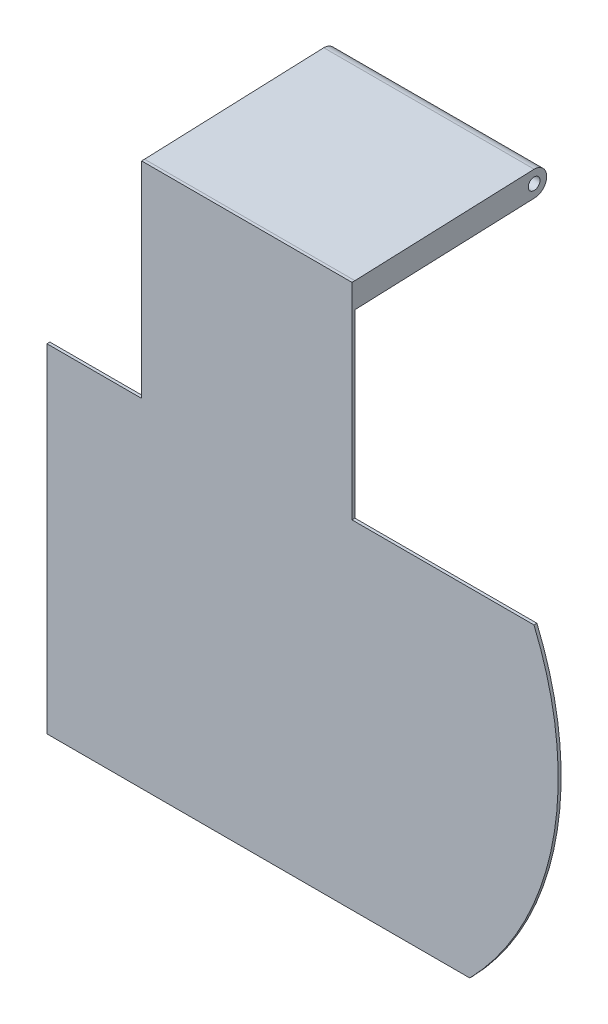
ISO-10303-21;
HEADER;
FILE_DESCRIPTION(('STEP AP214'),'2;1');
FILE_NAME('part.step','',(''),(''),'','','');
FILE_SCHEMA(('AUTOMOTIVE_DESIGN { 1 0 10303 214 1 1 1 1 }'));
ENDSEC;
DATA;
#1=APPLICATION_CONTEXT('core data for automotive mechanical design processes');
#2=APPLICATION_PROTOCOL_DEFINITION('international standard','automotive_design',2000,#1);
#3=PRODUCT_CONTEXT('',#1,'mechanical');
#4=PRODUCT('Part','Part','',(#3));
#5=PRODUCT_RELATED_PRODUCT_CATEGORY('part','',(#4));
#6=PRODUCT_DEFINITION_FORMATION('','',#4);
#7=PRODUCT_DEFINITION_CONTEXT('part definition',#1,'design');
#8=PRODUCT_DEFINITION('design','',#6,#7);
#9=PRODUCT_DEFINITION_SHAPE('','',#8);
#10=(LENGTH_UNIT() NAMED_UNIT(*) SI_UNIT(.MILLI.,.METRE.));
#11=(NAMED_UNIT(*) PLANE_ANGLE_UNIT() SI_UNIT($,.RADIAN.));
#12=(NAMED_UNIT(*) SI_UNIT($,.STERADIAN.) SOLID_ANGLE_UNIT());
#13=UNCERTAINTY_MEASURE_WITH_UNIT(LENGTH_MEASURE(1.E-05),#10,'distance_accuracy_value','');
#14=(GEOMETRIC_REPRESENTATION_CONTEXT(3) GLOBAL_UNCERTAINTY_ASSIGNED_CONTEXT((#13)) GLOBAL_UNIT_ASSIGNED_CONTEXT((#10,
#11,#12)) REPRESENTATION_CONTEXT('',''));
#15=CARTESIAN_POINT('',(0.,0.,0.));
#16=DIRECTION('',(0.,0.,1.));
#17=DIRECTION('',(1.,0.,0.));
#18=AXIS2_PLACEMENT_3D('',#15,#16,#17);
#19=CARTESIAN_POINT('',(0.,0.,0.));
#20=DIRECTION('',(0.,0.,1.));
#21=DIRECTION('',(1.,0.,0.));
#22=AXIS2_PLACEMENT_3D('',#19,#20,#21);
#23=PLANE('',#22);
#24=DIRECTION('',(-1.,0.,0.));
#25=VECTOR('',#24,1.);
#26=CARTESIAN_POINT('',(102.003771717629,102.421724260112,0.));
#27=LINE('',#26,#25);
#28=CARTESIAN_POINT('',(35.8048401531913,102.421724260112,0.));
#29=VERTEX_POINT('',#28);
#30=CARTESIAN_POINT('',(-35.7951598468087,102.421724260112,0.));
#31=VERTEX_POINT('',#30);
#32=EDGE_CURVE('E55',#29,#31,#27,.T.);
#33=ORIENTED_EDGE('',*,*,#32,.F.);
#34=DIRECTION('',(0.,1.,0.));
#35=VECTOR('',#34,1.);
#36=CARTESIAN_POINT('',(35.8048401531913,41.,0.));
#37=LINE('',#36,#35);
#38=CARTESIAN_POINT('',(35.8048401531913,41.,0.));
#39=VERTEX_POINT('',#38);
#40=EDGE_CURVE('E181',#39,#29,#37,.T.);
#41=ORIENTED_EDGE('',*,*,#40,.F.);
#42=DIRECTION('',(1.,0.,0.));
#43=VECTOR('',#42,1.);
#44=CARTESIAN_POINT('',(0.,41.,0.));
#45=LINE('',#44,#43);
#46=CARTESIAN_POINT('',(97.7496803063826,41.,0.));
#47=VERTEX_POINT('',#46);
#48=EDGE_CURVE('E224',#39,#47,#45,.T.);
#49=ORIENTED_EDGE('',*,*,#48,.T.);
#50=CARTESIAN_POINT('',(0.,0.,0.));
#51=DIRECTION('',(0.,0.,1.));
#52=DIRECTION('',(1.,0.,0.));
#53=AXIS2_PLACEMENT_3D('',#50,#51,#52);
#54=CIRCLE('',#53,106.);
#55=CARTESIAN_POINT('',(75.8946638440411,-74.,0.));
#56=VERTEX_POINT('',#55);
#57=EDGE_CURVE('E220',#56,#47,#54,.T.);
#58=ORIENTED_EDGE('',*,*,#57,.F.);
#59=DIRECTION('',(1.,0.,0.));
#60=VECTOR('',#59,1.);
#61=CARTESIAN_POINT('',(0.,-74.,0.));
#62=LINE('',#61,#60);
#63=CARTESIAN_POINT('',(-68.,-74.,0.));
#64=VERTEX_POINT('',#63);
#65=EDGE_CURVE('E197',#64,#56,#62,.T.);
#66=ORIENTED_EDGE('',*,*,#65,.F.);
#67=DIRECTION('',(0.,1.,0.));
#68=VECTOR('',#67,1.);
#69=CARTESIAN_POINT('',(-68.,0.,0.));
#70=LINE('',#69,#68);
#71=CARTESIAN_POINT('',(-68.,41.,0.));
#72=VERTEX_POINT('',#71);
#73=EDGE_CURVE('E203',#64,#72,#70,.T.);
#74=ORIENTED_EDGE('',*,*,#73,.T.);
#75=CARTESIAN_POINT('',(-35.7951598468087,41.,0.));
#76=VERTEX_POINT('',#75);
#77=EDGE_CURVE('E225',#72,#76,#45,.T.);
#78=ORIENTED_EDGE('',*,*,#77,.T.);
#79=DIRECTION('',(0.,-1.,0.));
#80=VECTOR('',#79,1.);
#81=CARTESIAN_POINT('',(-35.7951598468087,111.,0.));
#82=LINE('',#81,#80);
#83=EDGE_CURVE('E62',#31,#76,#82,.T.);
#84=ORIENTED_EDGE('',*,*,#83,.F.);
#85=EDGE_LOOP('',(#33,#41,#49,#58,#66,#74,#78,#84));
#86=FACE_BOUND('',#85,.T.);
#87=ADVANCED_FACE('F39',(#86),#23,.F.);
#88=CARTESIAN_POINT('',(0.,41.,1.));
#89=DIRECTION('',(0.,1.,0.));
#90=DIRECTION('',(0.,0.,1.));
#91=AXIS2_PLACEMENT_3D('',#88,#89,#90);
#92=PLANE('',#91);
#93=DIRECTION('',(1.,0.,0.));
#94=VECTOR('',#93,1.);
#95=CARTESIAN_POINT('',(0.,41.,1.));
#96=LINE('',#95,#94);
#97=CARTESIAN_POINT('',(-68.,41.,1.));
#98=VERTEX_POINT('',#97);
#99=CARTESIAN_POINT('',(-35.7951598468087,41.,1.));
#100=VERTEX_POINT('',#99);
#101=EDGE_CURVE('E208',#98,#100,#96,.T.);
#102=ORIENTED_EDGE('',*,*,#101,.T.);
#103=DIRECTION('',(0.,0.,-1.));
#104=VECTOR('',#103,1.);
#105=CARTESIAN_POINT('',(-35.7951598468087,41.,1.));
#106=LINE('',#105,#104);
#107=EDGE_CURVE('E194',#100,#76,#106,.T.);
#108=ORIENTED_EDGE('',*,*,#107,.T.);
#109=ORIENTED_EDGE('',*,*,#77,.F.);
#110=DIRECTION('',(0.,0.,-1.));
#111=VECTOR('',#110,1.);
#112=CARTESIAN_POINT('',(-68.,41.,1.));
#113=LINE('',#112,#111);
#114=EDGE_CURVE('E234',#98,#72,#113,.T.);
#115=ORIENTED_EDGE('',*,*,#114,.F.);
#116=EDGE_LOOP('',(#102,#108,#109,#115));
#117=FACE_BOUND('',#116,.T.);
#118=ADVANCED_FACE('F280',(#117),#92,.T.);
#119=CARTESIAN_POINT('',(0.,-74.,1.));
#120=DIRECTION('',(0.,1.,0.));
#121=DIRECTION('',(0.,0.,1.));
#122=AXIS2_PLACEMENT_3D('',#119,#120,#121);
#123=PLANE('',#122);
#124=ORIENTED_EDGE('',*,*,#65,.T.);
#125=DIRECTION('',(0.,0.,-1.));
#126=VECTOR('',#125,1.);
#127=CARTESIAN_POINT('',(75.8946638440411,-74.,1.));
#128=LINE('',#127,#126);
#129=CARTESIAN_POINT('',(75.8946638440411,-74.,1.));
#130=VERTEX_POINT('',#129);
#131=EDGE_CURVE('E11',#130,#56,#128,.T.);
#132=ORIENTED_EDGE('',*,*,#131,.F.);
#133=DIRECTION('',(1.,0.,0.));
#134=VECTOR('',#133,1.);
#135=CARTESIAN_POINT('',(0.,-74.,1.));
#136=LINE('',#135,#134);
#137=CARTESIAN_POINT('',(-68.,-74.,1.));
#138=VERTEX_POINT('',#137);
#139=EDGE_CURVE('E198',#138,#130,#136,.T.);
#140=ORIENTED_EDGE('',*,*,#139,.F.);
#141=DIRECTION('',(0.,0.,-1.));
#142=VECTOR('',#141,1.);
#143=CARTESIAN_POINT('',(-68.,-74.,1.));
#144=LINE('',#143,#142);
#145=EDGE_CURVE('E216',#138,#64,#144,.T.);
#146=ORIENTED_EDGE('',*,*,#145,.T.);
#147=EDGE_LOOP('',(#124,#132,#140,#146));
#148=FACE_BOUND('',#147,.T.);
#149=ADVANCED_FACE('F41',(#148),#123,.F.);
#150=CARTESIAN_POINT('',(0.,0.,1.));
#151=DIRECTION('',(0.,0.,-1.));
#152=DIRECTION('',(-1.,0.,0.));
#153=AXIS2_PLACEMENT_3D('',#150,#151,#152);
#154=CYLINDRICAL_SURFACE('',#153,106.);
#155=ORIENTED_EDGE('',*,*,#57,.T.);
#156=DIRECTION('',(0.,0.,-1.));
#157=VECTOR('',#156,1.);
#158=CARTESIAN_POINT('',(97.7496803063826,41.,1.));
#159=LINE('',#158,#157);
#160=CARTESIAN_POINT('',(97.7496803063826,41.,1.));
#161=VERTEX_POINT('',#160);
#162=EDGE_CURVE('E48',#161,#47,#159,.T.);
#163=ORIENTED_EDGE('',*,*,#162,.F.);
#164=CARTESIAN_POINT('',(0.,0.,1.));
#165=DIRECTION('',(0.,0.,1.));
#166=DIRECTION('',(1.,0.,0.));
#167=AXIS2_PLACEMENT_3D('',#164,#165,#166);
#168=CIRCLE('',#167,106.);
#169=EDGE_CURVE('E202',#130,#161,#168,.T.);
#170=ORIENTED_EDGE('',*,*,#169,.F.);
#171=ORIENTED_EDGE('',*,*,#131,.T.);
#172=EDGE_LOOP('',(#155,#163,#170,#171));
#173=FACE_BOUND('',#172,.T.);
#174=ADVANCED_FACE('F245',(#173),#154,.T.);
#175=DIRECTION('',(0.,0.,-1.));
#176=VECTOR('',#175,1.);
#177=CARTESIAN_POINT('',(35.8048401531913,41.,1.));
#178=LINE('',#177,#176);
#179=CARTESIAN_POINT('',(35.8048401531913,41.,1.));
#180=VERTEX_POINT('',#179);
#181=EDGE_CURVE('E191',#180,#39,#178,.T.);
#182=ORIENTED_EDGE('',*,*,#181,.F.);
#183=EDGE_CURVE('E207',#180,#161,#96,.T.);
#184=ORIENTED_EDGE('',*,*,#183,.T.);
#185=ORIENTED_EDGE('',*,*,#162,.T.);
#186=ORIENTED_EDGE('',*,*,#48,.F.);
#187=EDGE_LOOP('',(#182,#184,#185,#186));
#188=FACE_BOUND('',#187,.T.);
#189=ADVANCED_FACE('F242',(#188),#92,.T.);
#190=CARTESIAN_POINT('',(-68.,0.,1.));
#191=DIRECTION('',(-1.,0.,0.));
#192=DIRECTION('',(0.,-1.,0.));
#193=AXIS2_PLACEMENT_3D('',#190,#191,#192);
#194=PLANE('',#193);
#195=ORIENTED_EDGE('',*,*,#73,.F.);
#196=ORIENTED_EDGE('',*,*,#145,.F.);
#197=DIRECTION('',(0.,1.,0.));
#198=VECTOR('',#197,1.);
#199=CARTESIAN_POINT('',(-68.,0.,1.));
#200=LINE('',#199,#198);
#201=EDGE_CURVE('E212',#138,#98,#200,.T.);
#202=ORIENTED_EDGE('',*,*,#201,.T.);
#203=ORIENTED_EDGE('',*,*,#114,.T.);
#204=EDGE_LOOP('',(#195,#196,#202,#203));
#205=FACE_BOUND('',#204,.T.);
#206=ADVANCED_FACE('F277',(#205),#194,.T.);
#207=CARTESIAN_POINT('',(0.,0.,1.));
#208=DIRECTION('',(0.,0.,1.));
#209=DIRECTION('',(1.,0.,0.));
#210=AXIS2_PLACEMENT_3D('',#207,#208,#209);
#211=PLANE('',#210);
#212=ORIENTED_EDGE('',*,*,#139,.T.);
#213=ORIENTED_EDGE('',*,*,#169,.T.);
#214=ORIENTED_EDGE('',*,*,#183,.F.);
#215=DIRECTION('',(0.,1.,0.));
#216=VECTOR('',#215,1.);
#217=CARTESIAN_POINT('',(35.8048401531913,41.,1.));
#218=LINE('',#217,#216);
#219=CARTESIAN_POINT('',(35.8048401531913,111.,1.));
#220=VERTEX_POINT('',#219);
#221=EDGE_CURVE('E171',#180,#220,#218,.T.);
#222=ORIENTED_EDGE('',*,*,#221,.T.);
#223=DIRECTION('',(-1.,0.,0.));
#224=VECTOR('',#223,1.);
#225=CARTESIAN_POINT('',(35.8048401531913,111.,1.));
#226=LINE('',#225,#224);
#227=CARTESIAN_POINT('',(-35.7951598468087,111.,1.));
#228=VERTEX_POINT('',#227);
#229=EDGE_CURVE('E175',#220,#228,#226,.T.);
#230=ORIENTED_EDGE('',*,*,#229,.T.);
#231=DIRECTION('',(0.,-1.,0.));
#232=VECTOR('',#231,1.);
#233=CARTESIAN_POINT('',(-35.7951598468087,111.,1.));
#234=LINE('',#233,#232);
#235=EDGE_CURVE('E168',#228,#100,#234,.T.);
#236=ORIENTED_EDGE('',*,*,#235,.T.);
#237=ORIENTED_EDGE('',*,*,#101,.F.);
#238=ORIENTED_EDGE('',*,*,#201,.F.);
#239=EDGE_LOOP('',(#212,#213,#214,#222,#230,#236,#237,#238));
#240=FACE_BOUND('',#239,.T.);
#241=ADVANCED_FACE('F271',(#240),#211,.T.);
#242=CARTESIAN_POINT('',(-35.7951598468087,111.,1.));
#243=DIRECTION('',(1.,0.,0.));
#244=DIRECTION('',(0.,0.,-1.));
#245=AXIS2_PLACEMENT_3D('',#242,#243,#244);
#246=PLANE('',#245);
#247=DIRECTION('',(0.,0.,-1.));
#248=VECTOR('',#247,1.);
#249=CARTESIAN_POINT('',(-35.7951598468087,111.,1.));
#250=LINE('',#249,#248);
#251=CARTESIAN_POINT('',(-35.7951598468087,111.,0.));
#252=VERTEX_POINT('',#251);
#253=EDGE_CURVE('E178',#228,#252,#250,.T.);
#254=ORIENTED_EDGE('',*,*,#253,.T.);
#255=DIRECTION('',(0.,0.0386455009064933,-0.999252983613102));
#256=VECTOR('',#255,1.);
#257=CARTESIAN_POINT('',(-35.7951598468087,113.359137869944,-61.));
#258=LINE('',#257,#256);
#259=CARTESIAN_POINT('',(-35.7951598468087,113.359137869944,-61.));
#260=VERTEX_POINT('',#259);
#261=EDGE_CURVE('E137',#252,#260,#258,.T.);
#262=ORIENTED_EDGE('',*,*,#261,.T.);
#263=CARTESIAN_POINT('',(-35.7951598468087,109.07,-61.));
#264=DIRECTION('',(-1.,0.,0.));
#265=DIRECTION('',(0.,0.,-1.));
#266=AXIS2_PLACEMENT_3D('',#263,#264,#265);
#267=CIRCLE('',#266,4.28913786994391);
#268=CARTESIAN_POINT('',(-35.7951598468087,104.780862130056,-61.));
#269=VERTEX_POINT('',#268);
#270=EDGE_CURVE('E131',#260,#269,#267,.T.);
#271=ORIENTED_EDGE('',*,*,#270,.T.);
#272=DIRECTION('',(0.,-0.0386455009064933,0.999252983613102));
#273=VECTOR('',#272,1.);
#274=CARTESIAN_POINT('',(-35.7951598468087,104.780862130056,-61.));
#275=LINE('',#274,#273);
#276=EDGE_CURVE('E139',#269,#31,#275,.T.);
#277=ORIENTED_EDGE('',*,*,#276,.T.);
#278=ORIENTED_EDGE('',*,*,#83,.T.);
#279=ORIENTED_EDGE('',*,*,#107,.F.);
#280=ORIENTED_EDGE('',*,*,#235,.F.);
#281=EDGE_LOOP('',(#254,#262,#271,#277,#278,#279,#280));
#282=FACE_BOUND('',#281,.T.);
#283=CARTESIAN_POINT('',(-35.7951598468087,109.07,-61.));
#284=DIRECTION('',(-1.,0.,0.));
#285=DIRECTION('',(0.,0.,1.));
#286=AXIS2_PLACEMENT_3D('',#283,#284,#285);
#287=CIRCLE('',#286,2.);
#288=CARTESIAN_POINT('',(-35.7951598468087,109.07,-59.));
#289=VERTEX_POINT('',#288);
#290=EDGE_CURVE('E148',#289,#289,#287,.T.);
#291=ORIENTED_EDGE('',*,*,#290,.F.);
#292=EDGE_LOOP('',(#291));
#293=FACE_BOUND('',#292,.T.);
#294=ADVANCED_FACE('F144',(#282,#293),#246,.F.);
#295=CARTESIAN_POINT('',(35.8048401531913,41.,1.));
#296=DIRECTION('',(-1.,0.,0.));
#297=DIRECTION('',(0.,0.,1.));
#298=AXIS2_PLACEMENT_3D('',#295,#296,#297);
#299=PLANE('',#298);
#300=ORIENTED_EDGE('',*,*,#40,.T.);
#301=DIRECTION('',(0.,0.0386455009064933,-0.999252983613102));
#302=VECTOR('',#301,1.);
#303=CARTESIAN_POINT('',(35.8048401531913,104.780862130056,-61.));
#304=LINE('',#303,#302);
#305=CARTESIAN_POINT('',(35.8048401531913,104.780862130056,-61.));
#306=VERTEX_POINT('',#305);
#307=EDGE_CURVE('E167',#29,#306,#304,.T.);
#308=ORIENTED_EDGE('',*,*,#307,.T.);
#309=CARTESIAN_POINT('',(35.8048401531913,109.07,-61.));
#310=DIRECTION('',(-1.,0.,0.));
#311=DIRECTION('',(0.,0.,1.));
#312=AXIS2_PLACEMENT_3D('',#309,#310,#311);
#313=CIRCLE('',#312,4.28913786994391);
#314=CARTESIAN_POINT('',(35.8048401531913,113.359137869944,-61.));
#315=VERTEX_POINT('',#314);
#316=EDGE_CURVE('E133',#306,#315,#313,.F.);
#317=ORIENTED_EDGE('',*,*,#316,.T.);
#318=DIRECTION('',(0.,-0.0386455009064933,0.999252983613102));
#319=VECTOR('',#318,1.);
#320=CARTESIAN_POINT('',(35.8048401531913,113.359137869944,-61.));
#321=LINE('',#320,#319);
#322=CARTESIAN_POINT('',(35.8048401531913,111.,0.));
#323=VERTEX_POINT('',#322);
#324=EDGE_CURVE('E160',#315,#323,#321,.T.);
#325=ORIENTED_EDGE('',*,*,#324,.T.);
#326=DIRECTION('',(0.,0.,-1.));
#327=VECTOR('',#326,1.);
#328=CARTESIAN_POINT('',(35.8048401531913,111.,1.));
#329=LINE('',#328,#327);
#330=EDGE_CURVE('E188',#220,#323,#329,.T.);
#331=ORIENTED_EDGE('',*,*,#330,.F.);
#332=ORIENTED_EDGE('',*,*,#221,.F.);
#333=ORIENTED_EDGE('',*,*,#181,.T.);
#334=EDGE_LOOP('',(#300,#308,#317,#325,#331,#332,#333));
#335=FACE_BOUND('',#334,.T.);
#336=CARTESIAN_POINT('',(35.8048401531913,109.07,-61.));
#337=DIRECTION('',(-1.,0.,0.));
#338=DIRECTION('',(0.,0.,1.));
#339=AXIS2_PLACEMENT_3D('',#336,#337,#338);
#340=CIRCLE('',#339,2.);
#341=CARTESIAN_POINT('',(35.8048401531913,109.07,-59.));
#342=VERTEX_POINT('',#341);
#343=EDGE_CURVE('E163',#342,#342,#340,.F.);
#344=ORIENTED_EDGE('',*,*,#343,.F.);
#345=EDGE_LOOP('',(#344));
#346=FACE_BOUND('',#345,.T.);
#347=ADVANCED_FACE('F260',(#335,#346),#299,.F.);
#348=CARTESIAN_POINT('',(35.8048401531913,111.,1.));
#349=DIRECTION('',(0.,-1.,0.));
#350=DIRECTION('',(0.,0.,-1.));
#351=AXIS2_PLACEMENT_3D('',#348,#349,#350);
#352=PLANE('',#351);
#353=DIRECTION('',(-1.,0.,0.));
#354=VECTOR('',#353,1.);
#355=CARTESIAN_POINT('',(35.8048401531913,111.,0.));
#356=LINE('',#355,#354);
#357=EDGE_CURVE('E172',#323,#252,#356,.T.);
#358=ORIENTED_EDGE('',*,*,#357,.T.);
#359=ORIENTED_EDGE('',*,*,#253,.F.);
#360=ORIENTED_EDGE('',*,*,#229,.F.);
#361=ORIENTED_EDGE('',*,*,#330,.T.);
#362=EDGE_LOOP('',(#358,#359,#360,#361));
#363=FACE_BOUND('',#362,.T.);
#364=ADVANCED_FACE('F267',(#363),#352,.F.);
#365=CARTESIAN_POINT('',(102.003771717629,104.780862130056,-61.));
#366=DIRECTION('',(0.,-0.999252983613102,-0.0386455009064933));
#367=DIRECTION('',(0.,0.0386455009064933,-0.999252983613102));
#368=AXIS2_PLACEMENT_3D('',#365,#366,#367);
#369=PLANE('',#368);
#370=ORIENTED_EDGE('',*,*,#307,.F.);
#371=ORIENTED_EDGE('',*,*,#32,.T.);
#372=ORIENTED_EDGE('',*,*,#276,.F.);
#373=DIRECTION('',(-1.,0.,0.));
#374=VECTOR('',#373,1.);
#375=CARTESIAN_POINT('',(102.003771717629,104.780862130056,-61.));
#376=LINE('',#375,#374);
#377=EDGE_CURVE('E126',#306,#269,#376,.T.);
#378=ORIENTED_EDGE('',*,*,#377,.F.);
#379=EDGE_LOOP('',(#370,#371,#372,#378));
#380=FACE_BOUND('',#379,.T.);
#381=ADVANCED_FACE('F140',(#380),#369,.T.);
#382=CARTESIAN_POINT('',(102.003771717629,113.359137869944,-61.));
#383=DIRECTION('',(0.,0.999252983613102,0.0386455009064933));
#384=DIRECTION('',(0.,-0.0386455009064933,0.999252983613102));
#385=AXIS2_PLACEMENT_3D('',#382,#383,#384);
#386=PLANE('',#385);
#387=ORIENTED_EDGE('',*,*,#324,.F.);
#388=DIRECTION('',(-1.,0.,0.));
#389=VECTOR('',#388,1.);
#390=CARTESIAN_POINT('',(102.003771717629,113.359137869944,-61.));
#391=LINE('',#390,#389);
#392=EDGE_CURVE('E157',#315,#260,#391,.T.);
#393=ORIENTED_EDGE('',*,*,#392,.T.);
#394=ORIENTED_EDGE('',*,*,#261,.F.);
#395=ORIENTED_EDGE('',*,*,#357,.F.);
#396=EDGE_LOOP('',(#387,#393,#394,#395));
#397=FACE_BOUND('',#396,.T.);
#398=ADVANCED_FACE('F264',(#397),#386,.T.);
#399=CARTESIAN_POINT('',(102.003771717629,109.07,-61.));
#400=DIRECTION('',(-1.,0.,0.));
#401=DIRECTION('',(0.,0.,1.));
#402=AXIS2_PLACEMENT_3D('',#399,#400,#401);
#403=CYLINDRICAL_SURFACE('',#402,4.28913786994391);
#404=ORIENTED_EDGE('',*,*,#316,.F.);
#405=ORIENTED_EDGE('',*,*,#377,.T.);
#406=ORIENTED_EDGE('',*,*,#270,.F.);
#407=ORIENTED_EDGE('',*,*,#392,.F.);
#408=EDGE_LOOP('',(#404,#405,#406,#407));
#409=FACE_BOUND('',#408,.T.);
#410=ADVANCED_FACE('F128',(#409),#403,.T.);
#411=CARTESIAN_POINT('',(102.003771717629,109.07,-61.));
#412=DIRECTION('',(-1.,0.,0.));
#413=DIRECTION('',(0.,0.,1.));
#414=AXIS2_PLACEMENT_3D('',#411,#412,#413);
#415=CYLINDRICAL_SURFACE('',#414,2.);
#416=ORIENTED_EDGE('',*,*,#343,.T.);
#417=EDGE_LOOP('',(#416));
#418=FACE_BOUND('',#417,.T.);
#419=ORIENTED_EDGE('',*,*,#290,.T.);
#420=EDGE_LOOP('',(#419));
#421=FACE_BOUND('',#420,.T.);
#422=ADVANCED_FACE('F384',(#418,#421),#415,.F.);
#423=CLOSED_SHELL('',(#87,#118,#149,#174,#189,#206,#241,#294,#347,#364,#381,#398,#410,#422));
#424=MANIFOLD_SOLID_BREP('B2',#423);
#425=ADVANCED_BREP_SHAPE_REPRESENTATION('',(#18,#424),#14);
#426=SHAPE_DEFINITION_REPRESENTATION(#9,#425);
ENDSEC;
END-ISO-10303-21;
